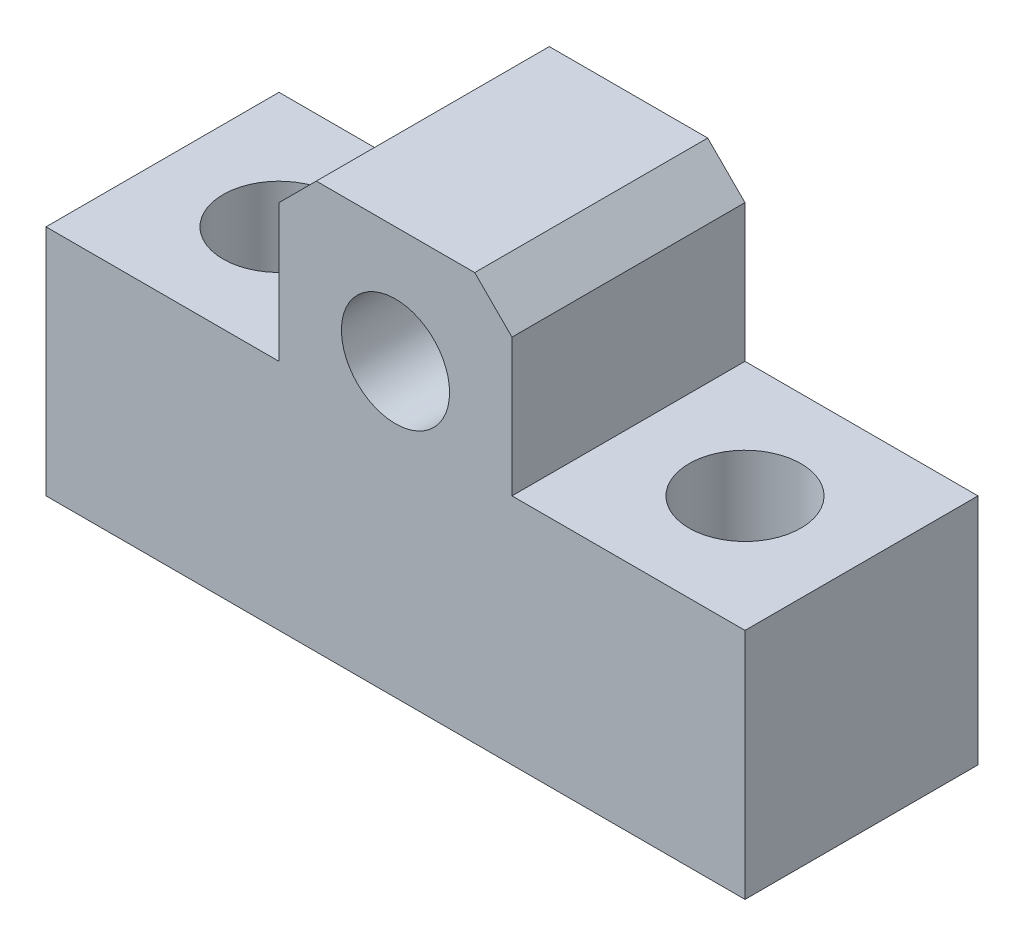
ISO-10303-21;
HEADER;
FILE_DESCRIPTION(('STEP AP214'),'2;1');
FILE_NAME('part.step','',(''),(''),'','','');
FILE_SCHEMA(('AUTOMOTIVE_DESIGN { 1 0 10303 214 1 1 1 1 }'));
ENDSEC;
DATA;
#1=APPLICATION_CONTEXT('core data for automotive mechanical design processes');
#2=APPLICATION_PROTOCOL_DEFINITION('international standard','automotive_design',2000,#1);
#3=PRODUCT_CONTEXT('',#1,'mechanical');
#4=PRODUCT('Part','Part','',(#3));
#5=PRODUCT_RELATED_PRODUCT_CATEGORY('part','',(#4));
#6=PRODUCT_DEFINITION_FORMATION('','',#4);
#7=PRODUCT_DEFINITION_CONTEXT('part definition',#1,'design');
#8=PRODUCT_DEFINITION('design','',#6,#7);
#9=PRODUCT_DEFINITION_SHAPE('','',#8);
#10=(LENGTH_UNIT() NAMED_UNIT(*) SI_UNIT(.MILLI.,.METRE.));
#11=(NAMED_UNIT(*) PLANE_ANGLE_UNIT() SI_UNIT($,.RADIAN.));
#12=(NAMED_UNIT(*) SI_UNIT($,.STERADIAN.) SOLID_ANGLE_UNIT());
#13=UNCERTAINTY_MEASURE_WITH_UNIT(LENGTH_MEASURE(1.E-05),#10,'distance_accuracy_value','');
#14=(GEOMETRIC_REPRESENTATION_CONTEXT(3) GLOBAL_UNCERTAINTY_ASSIGNED_CONTEXT((#13)) GLOBAL_UNIT_ASSIGNED_CONTEXT((#10,
#11,#12)) REPRESENTATION_CONTEXT('',''));
#15=CARTESIAN_POINT('',(0.,0.,0.));
#16=DIRECTION('',(0.,0.,1.));
#17=DIRECTION('',(1.,0.,0.));
#18=AXIS2_PLACEMENT_3D('',#15,#16,#17);
#19=CARTESIAN_POINT('',(-9.525,3.175,6.35));
#20=DIRECTION('',(0.,-1.,0.));
#21=DIRECTION('',(0.,0.,-1.));
#22=AXIS2_PLACEMENT_3D('',#19,#20,#21);
#23=PLANE('',#22);
#24=CARTESIAN_POINT('',(6.35,3.175,3.175));
#25=DIRECTION('',(0.,1.,0.));
#26=DIRECTION('',(0.,0.,1.));
#27=AXIS2_PLACEMENT_3D('',#24,#25,#26);
#28=CIRCLE('',#27,1.52399999999999);
#29=CARTESIAN_POINT('',(6.35,3.175,4.69899999999999));
#30=VERTEX_POINT('',#29);
#31=EDGE_CURVE('E283',#30,#30,#28,.T.);
#32=ORIENTED_EDGE('',*,*,#31,.F.);
#33=EDGE_LOOP('',(#32));
#34=FACE_BOUND('',#33,.T.);
#35=DIRECTION('',(0.,0.,-1.));
#36=VECTOR('',#35,1.);
#37=CARTESIAN_POINT('',(3.175,3.175,0.));
#38=LINE('',#37,#36);
#39=CARTESIAN_POINT('',(3.175,3.175,6.35));
#40=VERTEX_POINT('',#39);
#41=CARTESIAN_POINT('',(3.175,3.175,0.));
#42=VERTEX_POINT('',#41);
#43=EDGE_CURVE('E139',#40,#42,#38,.T.);
#44=ORIENTED_EDGE('',*,*,#43,.F.);
#45=DIRECTION('',(-1.,0.,0.));
#46=VECTOR('',#45,1.);
#47=CARTESIAN_POINT('',(-9.525,3.175,6.35));
#48=LINE('',#47,#46);
#49=CARTESIAN_POINT('',(9.525,3.175,6.35));
#50=VERTEX_POINT('',#49);
#51=EDGE_CURVE('E133',#50,#40,#48,.T.);
#52=ORIENTED_EDGE('',*,*,#51,.F.);
#53=DIRECTION('',(0.,0.,-1.));
#54=VECTOR('',#53,1.);
#55=CARTESIAN_POINT('',(9.525,3.175,6.35));
#56=LINE('',#55,#54);
#57=CARTESIAN_POINT('',(9.525,3.175,0.));
#58=VERTEX_POINT('',#57);
#59=EDGE_CURVE('E171',#50,#58,#56,.T.);
#60=ORIENTED_EDGE('',*,*,#59,.T.);
#61=DIRECTION('',(-1.,0.,0.));
#62=VECTOR('',#61,1.);
#63=CARTESIAN_POINT('',(-9.525,3.175,0.));
#64=LINE('',#63,#62);
#65=EDGE_CURVE('E157',#58,#42,#64,.T.);
#66=ORIENTED_EDGE('',*,*,#65,.T.);
#67=EDGE_LOOP('',(#44,#52,#60,#66));
#68=FACE_BOUND('',#67,.T.);
#69=ADVANCED_FACE('F39',(#34,#68),#23,.F.);
#70=CARTESIAN_POINT('',(-6.35,3.175,3.175));
#71=DIRECTION('',(0.,1.,0.));
#72=DIRECTION('',(0.,0.,1.));
#73=AXIS2_PLACEMENT_3D('',#70,#71,#72);
#74=CIRCLE('',#73,1.52399999999999);
#75=CARTESIAN_POINT('',(-6.35,3.175,4.69899999999999));
#76=VERTEX_POINT('',#75);
#77=EDGE_CURVE('E275',#76,#76,#74,.T.);
#78=ORIENTED_EDGE('',*,*,#77,.F.);
#79=EDGE_LOOP('',(#78));
#80=FACE_BOUND('',#79,.T.);
#81=DIRECTION('',(0.,0.,1.));
#82=VECTOR('',#81,1.);
#83=CARTESIAN_POINT('',(-3.175,3.175,0.));
#84=LINE('',#83,#82);
#85=CARTESIAN_POINT('',(-3.175,3.175,0.));
#86=VERTEX_POINT('',#85);
#87=CARTESIAN_POINT('',(-3.175,3.175,6.35));
#88=VERTEX_POINT('',#87);
#89=EDGE_CURVE('E128',#86,#88,#84,.T.);
#90=ORIENTED_EDGE('',*,*,#89,.F.);
#91=CARTESIAN_POINT('',(-9.525,3.175,0.));
#92=VERTEX_POINT('',#91);
#93=EDGE_CURVE('E167',#86,#92,#64,.T.);
#94=ORIENTED_EDGE('',*,*,#93,.T.);
#95=DIRECTION('',(0.,0.,-1.));
#96=VECTOR('',#95,1.);
#97=CARTESIAN_POINT('',(-9.525,3.175,6.35));
#98=LINE('',#97,#96);
#99=CARTESIAN_POINT('',(-9.525,3.175,6.35));
#100=VERTEX_POINT('',#99);
#101=EDGE_CURVE('E131',#100,#92,#98,.T.);
#102=ORIENTED_EDGE('',*,*,#101,.F.);
#103=EDGE_CURVE('E117',#88,#100,#48,.T.);
#104=ORIENTED_EDGE('',*,*,#103,.F.);
#105=EDGE_LOOP('',(#90,#94,#102,#104));
#106=FACE_BOUND('',#105,.T.);
#107=ADVANCED_FACE('F127',(#80,#106),#23,.F.);
#108=CARTESIAN_POINT('',(-9.525,3.175,6.35));
#109=DIRECTION('',(1.,0.,0.));
#110=DIRECTION('',(0.,0.,-1.));
#111=AXIS2_PLACEMENT_3D('',#108,#109,#110);
#112=PLANE('',#111);
#113=DIRECTION('',(0.,-1.,0.));
#114=VECTOR('',#113,1.);
#115=CARTESIAN_POINT('',(-9.525,3.175,0.));
#116=LINE('',#115,#114);
#117=CARTESIAN_POINT('',(-9.525,-3.175,0.));
#118=VERTEX_POINT('',#117);
#119=EDGE_CURVE('E153',#92,#118,#116,.T.);
#120=ORIENTED_EDGE('',*,*,#119,.T.);
#121=DIRECTION('',(0.,0.,-1.));
#122=VECTOR('',#121,1.);
#123=CARTESIAN_POINT('',(-9.525,-3.175,6.35));
#124=LINE('',#123,#122);
#125=CARTESIAN_POINT('',(-9.525,-3.175,6.35));
#126=VERTEX_POINT('',#125);
#127=EDGE_CURVE('E177',#126,#118,#124,.T.);
#128=ORIENTED_EDGE('',*,*,#127,.F.);
#129=DIRECTION('',(0.,-1.,0.));
#130=VECTOR('',#129,1.);
#131=CARTESIAN_POINT('',(-9.525,3.175,6.35));
#132=LINE('',#131,#130);
#133=EDGE_CURVE('E154',#100,#126,#132,.T.);
#134=ORIENTED_EDGE('',*,*,#133,.F.);
#135=ORIENTED_EDGE('',*,*,#101,.T.);
#136=EDGE_LOOP('',(#120,#128,#134,#135));
#137=FACE_BOUND('',#136,.T.);
#138=ADVANCED_FACE('F218',(#137),#112,.F.);
#139=CARTESIAN_POINT('',(-9.525,-3.175,6.35));
#140=DIRECTION('',(0.,1.,0.));
#141=DIRECTION('',(0.,0.,1.));
#142=AXIS2_PLACEMENT_3D('',#139,#140,#141);
#143=PLANE('',#142);
#144=CARTESIAN_POINT('',(-6.35,-3.175,3.175));
#145=DIRECTION('',(0.,1.,0.));
#146=DIRECTION('',(0.,0.,1.));
#147=AXIS2_PLACEMENT_3D('',#144,#145,#146);
#148=CIRCLE('',#147,1.524);
#149=CARTESIAN_POINT('',(-6.35,-3.175,4.699));
#150=VERTEX_POINT('',#149);
#151=EDGE_CURVE('E280',#150,#150,#148,.T.);
#152=ORIENTED_EDGE('',*,*,#151,.T.);
#153=EDGE_LOOP('',(#152));
#154=FACE_BOUND('',#153,.T.);
#155=CARTESIAN_POINT('',(6.35,-3.175,3.175));
#156=DIRECTION('',(0.,1.,0.));
#157=DIRECTION('',(0.,0.,1.));
#158=AXIS2_PLACEMENT_3D('',#155,#156,#157);
#159=CIRCLE('',#158,1.524);
#160=CARTESIAN_POINT('',(6.35,-3.175,4.699));
#161=VERTEX_POINT('',#160);
#162=EDGE_CURVE('E145',#161,#161,#159,.T.);
#163=ORIENTED_EDGE('',*,*,#162,.T.);
#164=EDGE_LOOP('',(#163));
#165=FACE_BOUND('',#164,.T.);
#166=DIRECTION('',(1.,0.,0.));
#167=VECTOR('',#166,1.);
#168=CARTESIAN_POINT('',(-9.525,-3.175,0.));
#169=LINE('',#168,#167);
#170=CARTESIAN_POINT('',(9.525,-3.175,0.));
#171=VERTEX_POINT('',#170);
#172=EDGE_CURVE('E163',#118,#171,#169,.T.);
#173=ORIENTED_EDGE('',*,*,#172,.T.);
#174=DIRECTION('',(0.,0.,-1.));
#175=VECTOR('',#174,1.);
#176=CARTESIAN_POINT('',(9.525,-3.175,6.35));
#177=LINE('',#176,#175);
#178=CARTESIAN_POINT('',(9.525,-3.175,6.35));
#179=VERTEX_POINT('',#178);
#180=EDGE_CURVE('E174',#179,#171,#177,.T.);
#181=ORIENTED_EDGE('',*,*,#180,.F.);
#182=DIRECTION('',(1.,0.,0.));
#183=VECTOR('',#182,1.);
#184=CARTESIAN_POINT('',(-9.525,-3.175,6.35));
#185=LINE('',#184,#183);
#186=EDGE_CURVE('E156',#126,#179,#185,.T.);
#187=ORIENTED_EDGE('',*,*,#186,.F.);
#188=ORIENTED_EDGE('',*,*,#127,.T.);
#189=EDGE_LOOP('',(#173,#181,#187,#188));
#190=FACE_BOUND('',#189,.T.);
#191=ADVANCED_FACE('F216',(#154,#165,#190),#143,.F.);
#192=CARTESIAN_POINT('',(9.525,3.175,6.35));
#193=DIRECTION('',(-1.,0.,0.));
#194=DIRECTION('',(0.,0.,1.));
#195=AXIS2_PLACEMENT_3D('',#192,#193,#194);
#196=PLANE('',#195);
#197=DIRECTION('',(0.,1.,0.));
#198=VECTOR('',#197,1.);
#199=CARTESIAN_POINT('',(9.525,3.175,0.));
#200=LINE('',#199,#198);
#201=EDGE_CURVE('E165',#171,#58,#200,.T.);
#202=ORIENTED_EDGE('',*,*,#201,.T.);
#203=ORIENTED_EDGE('',*,*,#59,.F.);
#204=DIRECTION('',(0.,1.,0.));
#205=VECTOR('',#204,1.);
#206=CARTESIAN_POINT('',(9.525,3.175,6.35));
#207=LINE('',#206,#205);
#208=EDGE_CURVE('E134',#179,#50,#207,.T.);
#209=ORIENTED_EDGE('',*,*,#208,.F.);
#210=ORIENTED_EDGE('',*,*,#180,.T.);
#211=EDGE_LOOP('',(#202,#203,#209,#210));
#212=FACE_BOUND('',#211,.T.);
#213=ADVANCED_FACE('F211',(#212),#196,.F.);
#214=CARTESIAN_POINT('',(0.,0.,6.35));
#215=DIRECTION('',(0.,0.,1.));
#216=DIRECTION('',(1.,0.,0.));
#217=AXIS2_PLACEMENT_3D('',#214,#215,#216);
#218=PLANE('',#217);
#219=CARTESIAN_POINT('',(0.,4.7625,6.35));
#220=DIRECTION('',(0.,0.,1.));
#221=DIRECTION('',(1.,0.,0.));
#222=AXIS2_PLACEMENT_3D('',#219,#220,#221);
#223=CIRCLE('',#222,1.4732);
#224=CARTESIAN_POINT('',(1.4732,4.7625,6.35));
#225=VERTEX_POINT('',#224);
#226=EDGE_CURVE('E273',#225,#225,#223,.T.);
#227=ORIENTED_EDGE('',*,*,#226,.F.);
#228=EDGE_LOOP('',(#227));
#229=FACE_BOUND('',#228,.T.);
#230=DIRECTION('',(0.,-1.,0.));
#231=VECTOR('',#230,1.);
#232=CARTESIAN_POINT('',(3.175,7.9375,6.35));
#233=LINE('',#232,#231);
#234=CARTESIAN_POINT('',(3.175,6.92149999999999,6.35));
#235=VERTEX_POINT('',#234);
#236=EDGE_CURVE('E123',#235,#40,#233,.T.);
#237=ORIENTED_EDGE('',*,*,#236,.F.);
#238=DIRECTION('',(0.707106781186545,-0.70710678118655,0.));
#239=VECTOR('',#238,1.);
#240=CARTESIAN_POINT('',(5.04825000000001,5.04824999999997,6.35));
#241=LINE('',#240,#239);
#242=CARTESIAN_POINT('',(2.159,7.9375,6.35));
#243=VERTEX_POINT('',#242);
#244=EDGE_CURVE('E47',#235,#243,#241,.F.);
#245=ORIENTED_EDGE('',*,*,#244,.T.);
#246=DIRECTION('',(1.,0.,0.));
#247=VECTOR('',#246,1.);
#248=CARTESIAN_POINT('',(3.175,7.9375,6.35));
#249=LINE('',#248,#247);
#250=CARTESIAN_POINT('',(-2.159,7.9375,6.35));
#251=VERTEX_POINT('',#250);
#252=EDGE_CURVE('E142',#251,#243,#249,.T.);
#253=ORIENTED_EDGE('',*,*,#252,.F.);
#254=DIRECTION('',(0.707106781186545,0.70710678118655,0.));
#255=VECTOR('',#254,1.);
#256=CARTESIAN_POINT('',(-5.04825000000001,5.04824999999997,6.35));
#257=LINE('',#256,#255);
#258=CARTESIAN_POINT('',(-3.175,6.92149999999999,6.35));
#259=VERTEX_POINT('',#258);
#260=EDGE_CURVE('E54',#251,#259,#257,.F.);
#261=ORIENTED_EDGE('',*,*,#260,.T.);
#262=DIRECTION('',(0.,-1.,0.));
#263=VECTOR('',#262,1.);
#264=CARTESIAN_POINT('',(-3.175,7.9375,6.35));
#265=LINE('',#264,#263);
#266=EDGE_CURVE('E113',#259,#88,#265,.T.);
#267=ORIENTED_EDGE('',*,*,#266,.T.);
#268=ORIENTED_EDGE('',*,*,#103,.T.);
#269=ORIENTED_EDGE('',*,*,#133,.T.);
#270=ORIENTED_EDGE('',*,*,#186,.T.);
#271=ORIENTED_EDGE('',*,*,#208,.T.);
#272=ORIENTED_EDGE('',*,*,#51,.T.);
#273=EDGE_LOOP('',(#237,#245,#253,#261,#267,#268,#269,#270,#271,#272));
#274=FACE_BOUND('',#273,.T.);
#275=ADVANCED_FACE('F115',(#229,#274),#218,.T.);
#276=CARTESIAN_POINT('',(0.,0.,0.));
#277=DIRECTION('',(0.,0.,1.));
#278=DIRECTION('',(1.,0.,0.));
#279=AXIS2_PLACEMENT_3D('',#276,#277,#278);
#280=PLANE('',#279);
#281=CARTESIAN_POINT('',(0.,4.7625,0.));
#282=DIRECTION('',(0.,0.,1.));
#283=DIRECTION('',(1.,0.,0.));
#284=AXIS2_PLACEMENT_3D('',#281,#282,#283);
#285=CIRCLE('',#284,1.4732);
#286=CARTESIAN_POINT('',(1.4732,4.7625,0.));
#287=VERTEX_POINT('',#286);
#288=EDGE_CURVE('E271',#287,#287,#285,.T.);
#289=ORIENTED_EDGE('',*,*,#288,.T.);
#290=EDGE_LOOP('',(#289));
#291=FACE_BOUND('',#290,.T.);
#292=DIRECTION('',(-1.,0.,0.));
#293=VECTOR('',#292,1.);
#294=CARTESIAN_POINT('',(3.175,7.9375,0.));
#295=LINE('',#294,#293);
#296=CARTESIAN_POINT('',(2.159,7.9375,0.));
#297=VERTEX_POINT('',#296);
#298=CARTESIAN_POINT('',(-2.159,7.9375,0.));
#299=VERTEX_POINT('',#298);
#300=EDGE_CURVE('E138',#297,#299,#295,.T.);
#301=ORIENTED_EDGE('',*,*,#300,.F.);
#302=DIRECTION('',(-0.707106781186545,0.70710678118655,0.));
#303=VECTOR('',#302,1.);
#304=CARTESIAN_POINT('',(2.159,7.9375,0.));
#305=LINE('',#304,#303);
#306=CARTESIAN_POINT('',(3.175,6.92149999999999,0.));
#307=VERTEX_POINT('',#306);
#308=EDGE_CURVE('E188',#297,#307,#305,.F.);
#309=ORIENTED_EDGE('',*,*,#308,.T.);
#310=DIRECTION('',(0.,-1.,0.));
#311=VECTOR('',#310,1.);
#312=CARTESIAN_POINT('',(3.175,7.9375,0.));
#313=LINE('',#312,#311);
#314=EDGE_CURVE('E151',#307,#42,#313,.T.);
#315=ORIENTED_EDGE('',*,*,#314,.T.);
#316=ORIENTED_EDGE('',*,*,#65,.F.);
#317=ORIENTED_EDGE('',*,*,#201,.F.);
#318=ORIENTED_EDGE('',*,*,#172,.F.);
#319=ORIENTED_EDGE('',*,*,#119,.F.);
#320=ORIENTED_EDGE('',*,*,#93,.F.);
#321=DIRECTION('',(0.,-1.,0.));
#322=VECTOR('',#321,1.);
#323=CARTESIAN_POINT('',(-3.175,7.9375,0.));
#324=LINE('',#323,#322);
#325=CARTESIAN_POINT('',(-3.175,6.92149999999999,0.));
#326=VERTEX_POINT('',#325);
#327=EDGE_CURVE('E122',#326,#86,#324,.T.);
#328=ORIENTED_EDGE('',*,*,#327,.F.);
#329=DIRECTION('',(-0.707106781186545,-0.70710678118655,0.));
#330=VECTOR('',#329,1.);
#331=CARTESIAN_POINT('',(-2.159,7.9375,0.));
#332=LINE('',#331,#330);
#333=EDGE_CURVE('E186',#326,#299,#332,.F.);
#334=ORIENTED_EDGE('',*,*,#333,.T.);
#335=EDGE_LOOP('',(#301,#309,#315,#316,#317,#318,#319,#320,#328,#334));
#336=FACE_BOUND('',#335,.T.);
#337=ADVANCED_FACE('F201',(#291,#336),#280,.F.);
#338=CARTESIAN_POINT('',(3.175,7.9375,0.));
#339=DIRECTION('',(-1.,0.,0.));
#340=DIRECTION('',(0.,0.,1.));
#341=AXIS2_PLACEMENT_3D('',#338,#339,#340);
#342=PLANE('',#341);
#343=ORIENTED_EDGE('',*,*,#314,.F.);
#344=DIRECTION('',(0.,0.,1.));
#345=VECTOR('',#344,1.);
#346=CARTESIAN_POINT('',(3.175,6.92149999999999,0.));
#347=LINE('',#346,#345);
#348=EDGE_CURVE('E62',#307,#235,#347,.T.);
#349=ORIENTED_EDGE('',*,*,#348,.T.);
#350=ORIENTED_EDGE('',*,*,#236,.T.);
#351=ORIENTED_EDGE('',*,*,#43,.T.);
#352=EDGE_LOOP('',(#343,#349,#350,#351));
#353=FACE_BOUND('',#352,.T.);
#354=ADVANCED_FACE('F203',(#353),#342,.F.);
#355=CARTESIAN_POINT('',(-3.175,7.9375,0.));
#356=DIRECTION('',(1.,0.,0.));
#357=DIRECTION('',(0.,0.,-1.));
#358=AXIS2_PLACEMENT_3D('',#355,#356,#357);
#359=PLANE('',#358);
#360=ORIENTED_EDGE('',*,*,#266,.F.);
#361=DIRECTION('',(0.,0.,-1.));
#362=VECTOR('',#361,1.);
#363=CARTESIAN_POINT('',(-3.175,6.92149999999999,0.));
#364=LINE('',#363,#362);
#365=EDGE_CURVE('E11',#259,#326,#364,.T.);
#366=ORIENTED_EDGE('',*,*,#365,.T.);
#367=ORIENTED_EDGE('',*,*,#327,.T.);
#368=ORIENTED_EDGE('',*,*,#89,.T.);
#369=EDGE_LOOP('',(#360,#366,#367,#368));
#370=FACE_BOUND('',#369,.T.);
#371=ADVANCED_FACE('F136',(#370),#359,.F.);
#372=CARTESIAN_POINT('',(0.,7.9375,0.));
#373=DIRECTION('',(0.,-1.,0.));
#374=DIRECTION('',(0.,0.,-1.));
#375=AXIS2_PLACEMENT_3D('',#372,#373,#374);
#376=PLANE('',#375);
#377=ORIENTED_EDGE('',*,*,#252,.T.);
#378=DIRECTION('',(0.,0.,-1.));
#379=VECTOR('',#378,1.);
#380=CARTESIAN_POINT('',(2.159,7.9375,0.));
#381=LINE('',#380,#379);
#382=EDGE_CURVE('E183',#243,#297,#381,.T.);
#383=ORIENTED_EDGE('',*,*,#382,.T.);
#384=ORIENTED_EDGE('',*,*,#300,.T.);
#385=DIRECTION('',(0.,0.,1.));
#386=VECTOR('',#385,1.);
#387=CARTESIAN_POINT('',(-2.159,7.9375,0.));
#388=LINE('',#387,#386);
#389=EDGE_CURVE('E180',#299,#251,#388,.T.);
#390=ORIENTED_EDGE('',*,*,#389,.T.);
#391=EDGE_LOOP('',(#377,#383,#384,#390));
#392=FACE_BOUND('',#391,.T.);
#393=ADVANCED_FACE('F196',(#392),#376,.F.);
#394=CARTESIAN_POINT('',(6.35,3.175,3.175));
#395=DIRECTION('',(0.,1.,0.));
#396=DIRECTION('',(0.,0.,1.));
#397=AXIS2_PLACEMENT_3D('',#394,#395,#396);
#398=CYLINDRICAL_SURFACE('',#397,1.52399999999999);
#399=ORIENTED_EDGE('',*,*,#162,.F.);
#400=EDGE_LOOP('',(#399));
#401=FACE_BOUND('',#400,.T.);
#402=ORIENTED_EDGE('',*,*,#31,.T.);
#403=EDGE_LOOP('',(#402));
#404=FACE_BOUND('',#403,.T.);
#405=ADVANCED_FACE('F254',(#401,#404),#398,.F.);
#406=CARTESIAN_POINT('',(-6.35,3.175,3.175));
#407=DIRECTION('',(0.,1.,0.));
#408=DIRECTION('',(0.,0.,1.));
#409=AXIS2_PLACEMENT_3D('',#406,#407,#408);
#410=CYLINDRICAL_SURFACE('',#409,1.52399999999999);
#411=ORIENTED_EDGE('',*,*,#151,.F.);
#412=EDGE_LOOP('',(#411));
#413=FACE_BOUND('',#412,.T.);
#414=ORIENTED_EDGE('',*,*,#77,.T.);
#415=EDGE_LOOP('',(#414));
#416=FACE_BOUND('',#415,.T.);
#417=ADVANCED_FACE('F257',(#413,#416),#410,.F.);
#418=CARTESIAN_POINT('',(0.,4.7625,6.35));
#419=DIRECTION('',(0.,0.,1.));
#420=DIRECTION('',(1.,0.,0.));
#421=AXIS2_PLACEMENT_3D('',#418,#419,#420);
#422=CYLINDRICAL_SURFACE('',#421,1.4732);
#423=ORIENTED_EDGE('',*,*,#288,.F.);
#424=EDGE_LOOP('',(#423));
#425=FACE_BOUND('',#424,.T.);
#426=ORIENTED_EDGE('',*,*,#226,.T.);
#427=EDGE_LOOP('',(#426));
#428=FACE_BOUND('',#427,.T.);
#429=ADVANCED_FACE('F261',(#425,#428),#422,.F.);
#430=CARTESIAN_POINT('',(2.159,7.9375,0.));
#431=DIRECTION('',(-0.70710678118655,-0.707106781186545,0.));
#432=DIRECTION('',(0.,0.,-1.));
#433=AXIS2_PLACEMENT_3D('',#430,#431,#432);
#434=PLANE('',#433);
#435=ORIENTED_EDGE('',*,*,#244,.F.);
#436=ORIENTED_EDGE('',*,*,#348,.F.);
#437=ORIENTED_EDGE('',*,*,#308,.F.);
#438=ORIENTED_EDGE('',*,*,#382,.F.);
#439=EDGE_LOOP('',(#435,#436,#437,#438));
#440=FACE_BOUND('',#439,.T.);
#441=ADVANCED_FACE('F199',(#440),#434,.F.);
#442=CARTESIAN_POINT('',(-2.159,7.9375,0.));
#443=DIRECTION('',(0.70710678118655,-0.707106781186545,0.));
#444=DIRECTION('',(0.,0.,1.));
#445=AXIS2_PLACEMENT_3D('',#442,#443,#444);
#446=PLANE('',#445);
#447=ORIENTED_EDGE('',*,*,#333,.F.);
#448=ORIENTED_EDGE('',*,*,#365,.F.);
#449=ORIENTED_EDGE('',*,*,#260,.F.);
#450=ORIENTED_EDGE('',*,*,#389,.F.);
#451=EDGE_LOOP('',(#447,#448,#449,#450));
#452=FACE_BOUND('',#451,.T.);
#453=ADVANCED_FACE('F41',(#452),#446,.F.);
#454=CLOSED_SHELL('',(#69,#107,#138,#191,#213,#275,#337,#354,#371,#393,#405,#417,#429,#441,#453));
#455=MANIFOLD_SOLID_BREP('B2',#454);
#456=ADVANCED_BREP_SHAPE_REPRESENTATION('',(#18,#455),#14);
#457=SHAPE_DEFINITION_REPRESENTATION(#9,#456);
ENDSEC;
END-ISO-10303-21;
